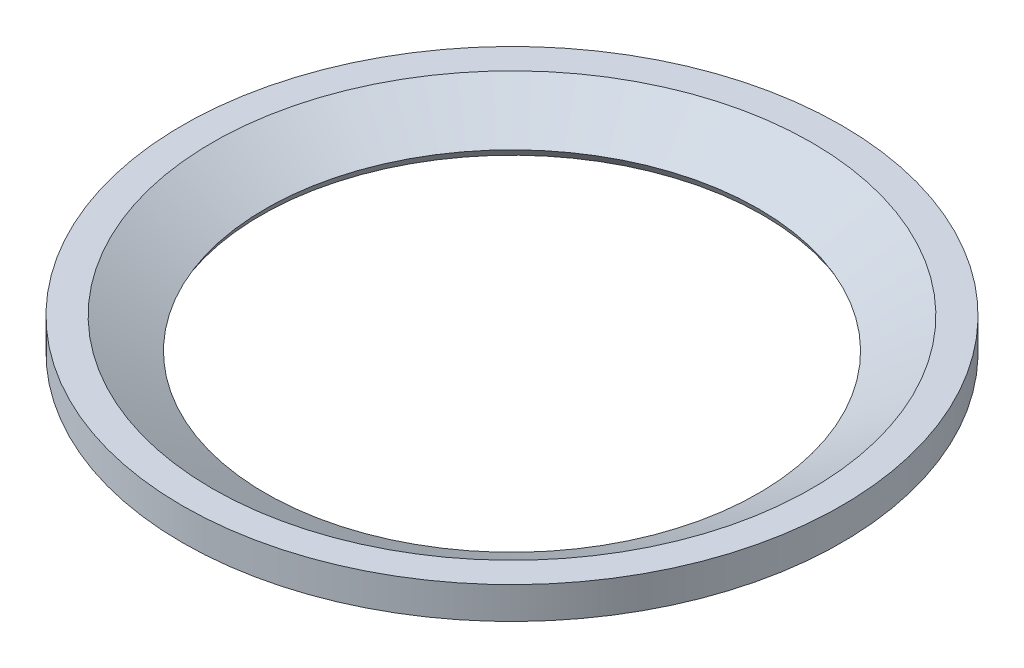
ISO-10303-21;
HEADER;
FILE_DESCRIPTION(('STEP AP214'),'2;1');
FILE_NAME('part.step','',(''),(''),'','','');
FILE_SCHEMA(('AUTOMOTIVE_DESIGN { 1 0 10303 214 1 1 1 1 }'));
ENDSEC;
DATA;
#1=APPLICATION_CONTEXT('core data for automotive mechanical design processes');
#2=APPLICATION_PROTOCOL_DEFINITION('international standard','automotive_design',2000,#1);
#3=PRODUCT_CONTEXT('',#1,'mechanical');
#4=PRODUCT('Part','Part','',(#3));
#5=PRODUCT_RELATED_PRODUCT_CATEGORY('part','',(#4));
#6=PRODUCT_DEFINITION_FORMATION('','',#4);
#7=PRODUCT_DEFINITION_CONTEXT('part definition',#1,'design');
#8=PRODUCT_DEFINITION('design','',#6,#7);
#9=PRODUCT_DEFINITION_SHAPE('','',#8);
#10=(LENGTH_UNIT() NAMED_UNIT(*) SI_UNIT(.MILLI.,.METRE.));
#11=(NAMED_UNIT(*) PLANE_ANGLE_UNIT() SI_UNIT($,.RADIAN.));
#12=(NAMED_UNIT(*) SI_UNIT($,.STERADIAN.) SOLID_ANGLE_UNIT());
#13=UNCERTAINTY_MEASURE_WITH_UNIT(LENGTH_MEASURE(1.E-05),#10,'distance_accuracy_value','');
#14=(GEOMETRIC_REPRESENTATION_CONTEXT(3) GLOBAL_UNCERTAINTY_ASSIGNED_CONTEXT((#13)) GLOBAL_UNIT_ASSIGNED_CONTEXT((#10,
#11,#12)) REPRESENTATION_CONTEXT('',''));
#15=CARTESIAN_POINT('',(0.,0.,0.));
#16=DIRECTION('',(0.,0.,1.));
#17=DIRECTION('',(1.,0.,0.));
#18=AXIS2_PLACEMENT_3D('',#15,#16,#17);
#19=CARTESIAN_POINT('',(0.,0.,0.));
#20=DIRECTION('',(0.,-1.,0.));
#21=DIRECTION('',(0.,0.,-1.));
#22=AXIS2_PLACEMENT_3D('',#19,#20,#21);
#23=CYLINDRICAL_SURFACE('',#22,45.847);
#24=CARTESIAN_POINT('',(0.,-3.175,0.));
#25=DIRECTION('',(0.,-1.,0.));
#26=DIRECTION('',(0.,0.,-1.));
#27=AXIS2_PLACEMENT_3D('',#24,#25,#26);
#28=CIRCLE('',#27,45.847);
#29=CARTESIAN_POINT('',(0.,-3.175,-45.847));
#30=VERTEX_POINT('',#29);
#31=EDGE_CURVE('E10',#30,#30,#28,.T.);
#32=ORIENTED_EDGE('',*,*,#31,.F.);
#33=EDGE_LOOP('',(#32));
#34=FACE_BOUND('',#33,.T.);
#35=CARTESIAN_POINT('',(0.,1.27,0.));
#36=DIRECTION('',(0.,-1.,0.));
#37=DIRECTION('',(0.,0.,-1.));
#38=AXIS2_PLACEMENT_3D('',#35,#36,#37);
#39=CIRCLE('',#38,45.847);
#40=CARTESIAN_POINT('',(0.,1.27,-45.847));
#41=VERTEX_POINT('',#40);
#42=EDGE_CURVE('E84',#41,#41,#39,.T.);
#43=ORIENTED_EDGE('',*,*,#42,.T.);
#44=EDGE_LOOP('',(#43));
#45=FACE_BOUND('',#44,.T.);
#46=ADVANCED_FACE('F47',(#34,#45),#23,.T.);
#47=CARTESIAN_POINT('',(-44.577,-3.175,0.));
#48=DIRECTION('',(0.,-1.,0.));
#49=DIRECTION('',(0.,0.,-1.));
#50=AXIS2_PLACEMENT_3D('',#47,#48,#49);
#51=PLANE('',#50);
#52=ORIENTED_EDGE('',*,*,#31,.T.);
#53=EDGE_LOOP('',(#52));
#54=FACE_BOUND('',#53,.T.);
#55=CARTESIAN_POINT('',(0.,-3.175,0.));
#56=DIRECTION('',(0.,-1.,0.));
#57=DIRECTION('',(0.,0.,-1.));
#58=AXIS2_PLACEMENT_3D('',#55,#56,#57);
#59=CIRCLE('',#58,44.577);
#60=CARTESIAN_POINT('',(0.,-3.175,-44.577));
#61=VERTEX_POINT('',#60);
#62=EDGE_CURVE('E54',#61,#61,#59,.T.);
#63=ORIENTED_EDGE('',*,*,#62,.F.);
#64=EDGE_LOOP('',(#63));
#65=FACE_BOUND('',#64,.T.);
#66=ADVANCED_FACE('F114',(#54,#65),#51,.T.);
#67=CARTESIAN_POINT('',(0.,0.,0.));
#68=DIRECTION('',(0.,-1.,0.));
#69=DIRECTION('',(0.,0.,-1.));
#70=AXIS2_PLACEMENT_3D('',#67,#68,#69);
#71=CYLINDRICAL_SURFACE('',#70,44.577);
#72=ORIENTED_EDGE('',*,*,#62,.T.);
#73=EDGE_LOOP('',(#72));
#74=FACE_BOUND('',#73,.T.);
#75=CARTESIAN_POINT('',(0.,0.,0.));
#76=DIRECTION('',(0.,-1.,0.));
#77=DIRECTION('',(0.,0.,-1.));
#78=AXIS2_PLACEMENT_3D('',#75,#76,#77);
#79=CIRCLE('',#78,44.577);
#80=CARTESIAN_POINT('',(0.,0.,-44.577));
#81=VERTEX_POINT('',#80);
#82=EDGE_CURVE('E62',#81,#81,#79,.T.);
#83=ORIENTED_EDGE('',*,*,#82,.F.);
#84=EDGE_LOOP('',(#83));
#85=FACE_BOUND('',#84,.T.);
#86=ADVANCED_FACE('F118',(#74,#85),#71,.F.);
#87=CARTESIAN_POINT('',(-44.577,0.,0.));
#88=DIRECTION('',(0.,-1.,0.));
#89=DIRECTION('',(0.,0.,-1.));
#90=AXIS2_PLACEMENT_3D('',#87,#88,#89);
#91=PLANE('',#90);
#92=ORIENTED_EDGE('',*,*,#82,.T.);
#93=EDGE_LOOP('',(#92));
#94=FACE_BOUND('',#93,.T.);
#95=CARTESIAN_POINT('',(0.,0.,0.));
#96=DIRECTION('',(0.,-1.,0.));
#97=DIRECTION('',(0.,0.,-1.));
#98=AXIS2_PLACEMENT_3D('',#95,#96,#97);
#99=CIRCLE('',#98,42.037);
#100=CARTESIAN_POINT('',(0.,0.,-42.037));
#101=VERTEX_POINT('',#100);
#102=EDGE_CURVE('E68',#101,#101,#99,.T.);
#103=ORIENTED_EDGE('',*,*,#102,.F.);
#104=EDGE_LOOP('',(#103));
#105=FACE_BOUND('',#104,.T.);
#106=ADVANCED_FACE('F110',(#94,#105),#91,.T.);
#107=CARTESIAN_POINT('',(0.,-4.10611511447663,0.));
#108=DIRECTION('',(0.,1.,0.));
#109=DIRECTION('',(0.,0.,1.));
#110=AXIS2_PLACEMENT_3D('',#107,#108,#109);
#111=CONICAL_SURFACE('',#110,34.925,1.0471975511966);
#112=ORIENTED_EDGE('',*,*,#102,.T.);
#113=EDGE_LOOP('',(#112));
#114=FACE_BOUND('',#113,.T.);
#115=CARTESIAN_POINT('',(0.,-4.10611511447663,0.));
#116=DIRECTION('',(0.,-1.,0.));
#117=DIRECTION('',(0.,0.,-1.));
#118=AXIS2_PLACEMENT_3D('',#115,#116,#117);
#119=CIRCLE('',#118,34.925);
#120=CARTESIAN_POINT('',(0.,-4.10611511447663,-34.925));
#121=VERTEX_POINT('',#120);
#122=EDGE_CURVE('E73',#121,#121,#119,.T.);
#123=ORIENTED_EDGE('',*,*,#122,.F.);
#124=EDGE_LOOP('',(#123));
#125=FACE_BOUND('',#124,.T.);
#126=ADVANCED_FACE('F105',(#114,#125),#111,.T.);
#127=CARTESIAN_POINT('',(0.,-3.00626285167039,0.));
#128=DIRECTION('',(0.,-1.,0.));
#129=DIRECTION('',(0.,0.,-1.));
#130=AXIS2_PLACEMENT_3D('',#127,#128,#129);
#131=CONICAL_SURFACE('',#130,34.29,0.523598775598302);
#132=ORIENTED_EDGE('',*,*,#122,.T.);
#133=EDGE_LOOP('',(#132));
#134=FACE_BOUND('',#133,.T.);
#135=CARTESIAN_POINT('',(0.,-3.00626285167039,0.));
#136=DIRECTION('',(0.,-1.,0.));
#137=DIRECTION('',(0.,0.,-1.));
#138=AXIS2_PLACEMENT_3D('',#135,#136,#137);
#139=CIRCLE('',#138,34.29);
#140=CARTESIAN_POINT('',(0.,-3.00626285167039,-34.29));
#141=VERTEX_POINT('',#140);
#142=EDGE_CURVE('E76',#141,#141,#139,.T.);
#143=ORIENTED_EDGE('',*,*,#142,.F.);
#144=EDGE_LOOP('',(#143));
#145=FACE_BOUND('',#144,.T.);
#146=ADVANCED_FACE('F100',(#134,#145),#131,.F.);
#147=CARTESIAN_POINT('',(0.,-3.00626285167039,0.));
#148=DIRECTION('',(0.,1.,0.));
#149=DIRECTION('',(0.,0.,1.));
#150=AXIS2_PLACEMENT_3D('',#147,#148,#149);
#151=CONICAL_SURFACE('',#150,34.29,1.0471975511966);
#152=CARTESIAN_POINT('',(0.,1.27,0.));
#153=DIRECTION('',(0.,-1.,0.));
#154=DIRECTION('',(0.,0.,-1.));
#155=AXIS2_PLACEMENT_3D('',#152,#153,#154);
#156=CIRCLE('',#155,41.6967045256125);
#157=CARTESIAN_POINT('',(0.,1.27,-41.6967045256125));
#158=VERTEX_POINT('',#157);
#159=EDGE_CURVE('E80',#158,#158,#156,.T.);
#160=ORIENTED_EDGE('',*,*,#159,.F.);
#161=EDGE_LOOP('',(#160));
#162=FACE_BOUND('',#161,.T.);
#163=ORIENTED_EDGE('',*,*,#142,.T.);
#164=EDGE_LOOP('',(#163));
#165=FACE_BOUND('',#164,.T.);
#166=ADVANCED_FACE('F94',(#162,#165),#151,.F.);
#167=CARTESIAN_POINT('',(-44.577,1.27,0.));
#168=DIRECTION('',(0.,-1.,0.));
#169=DIRECTION('',(0.,0.,-1.));
#170=AXIS2_PLACEMENT_3D('',#167,#168,#169);
#171=PLANE('',#170);
#172=ORIENTED_EDGE('',*,*,#42,.F.);
#173=EDGE_LOOP('',(#172));
#174=FACE_BOUND('',#173,.T.);
#175=ORIENTED_EDGE('',*,*,#159,.T.);
#176=EDGE_LOOP('',(#175));
#177=FACE_BOUND('',#176,.T.);
#178=ADVANCED_FACE('F91',(#174,#177),#171,.F.);
#179=CLOSED_SHELL('',(#46,#66,#86,#106,#126,#146,#166,#178));
#180=MANIFOLD_SOLID_BREP('B2',#179);
#181=ADVANCED_BREP_SHAPE_REPRESENTATION('',(#18,#180),#14);
#182=SHAPE_DEFINITION_REPRESENTATION(#9,#181);
ENDSEC;
END-ISO-10303-21;
